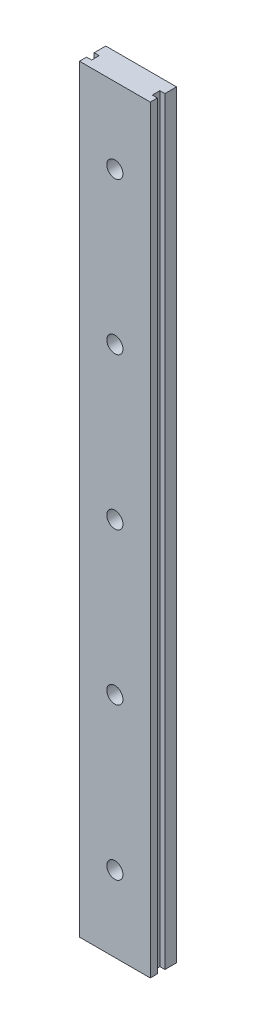
ISO-10303-21;
HEADER;
FILE_DESCRIPTION(('STEP AP214'),'2;1');
FILE_NAME('part.step','',(''),(''),'','','');
FILE_SCHEMA(('AUTOMOTIVE_DESIGN { 1 0 10303 214 1 1 1 1 }'));
ENDSEC;
DATA;
#1=APPLICATION_CONTEXT('core data for automotive mechanical design processes');
#2=APPLICATION_PROTOCOL_DEFINITION('international standard','automotive_design',2000,#1);
#3=PRODUCT_CONTEXT('',#1,'mechanical');
#4=PRODUCT('Part','Part','',(#3));
#5=PRODUCT_RELATED_PRODUCT_CATEGORY('part','',(#4));
#6=PRODUCT_DEFINITION_FORMATION('','',#4);
#7=PRODUCT_DEFINITION_CONTEXT('part definition',#1,'design');
#8=PRODUCT_DEFINITION('design','',#6,#7);
#9=PRODUCT_DEFINITION_SHAPE('','',#8);
#10=(LENGTH_UNIT() NAMED_UNIT(*) SI_UNIT(.MILLI.,.METRE.));
#11=(NAMED_UNIT(*) PLANE_ANGLE_UNIT() SI_UNIT($,.RADIAN.));
#12=(NAMED_UNIT(*) SI_UNIT($,.STERADIAN.) SOLID_ANGLE_UNIT());
#13=UNCERTAINTY_MEASURE_WITH_UNIT(LENGTH_MEASURE(1.E-05),#10,'distance_accuracy_value','');
#14=(GEOMETRIC_REPRESENTATION_CONTEXT(3) GLOBAL_UNCERTAINTY_ASSIGNED_CONTEXT((#13)) GLOBAL_UNIT_ASSIGNED_CONTEXT((#10,
#11,#12)) REPRESENTATION_CONTEXT('',''));
#15=CARTESIAN_POINT('',(0.,0.,0.));
#16=DIRECTION('',(0.,0.,1.));
#17=DIRECTION('',(1.,0.,0.));
#18=AXIS2_PLACEMENT_3D('',#15,#16,#17);
#19=CARTESIAN_POINT('',(0.,150.,0.));
#20=DIRECTION('',(0.,0.,-1.));
#21=DIRECTION('',(-1.,0.,0.));
#22=AXIS2_PLACEMENT_3D('',#19,#20,#21);
#23=PLANE('',#22);
#24=CARTESIAN_POINT('',(7.,15.,0.));
#25=DIRECTION('',(0.,0.,-1.));
#26=DIRECTION('',(-1.,0.,0.));
#27=AXIS2_PLACEMENT_3D('',#24,#25,#26);
#28=CIRCLE('',#27,1.6);
#29=CARTESIAN_POINT('',(5.4,15.,0.));
#30=VERTEX_POINT('',#29);
#31=EDGE_CURVE('E159',#30,#30,#28,.T.);
#32=ORIENTED_EDGE('',*,*,#31,.T.);
#33=EDGE_LOOP('',(#32));
#34=FACE_BOUND('',#33,.T.);
#35=CARTESIAN_POINT('',(7.0000000000001,45.,0.));
#36=DIRECTION('',(0.,0.,-1.));
#37=DIRECTION('',(-1.,0.,0.));
#38=AXIS2_PLACEMENT_3D('',#35,#36,#37);
#39=CIRCLE('',#38,1.6);
#40=CARTESIAN_POINT('',(5.4000000000001,45.,0.));
#41=VERTEX_POINT('',#40);
#42=EDGE_CURVE('E267',#41,#41,#39,.T.);
#43=ORIENTED_EDGE('',*,*,#42,.T.);
#44=EDGE_LOOP('',(#43));
#45=FACE_BOUND('',#44,.T.);
#46=CARTESIAN_POINT('',(7.00000000000021,75.,0.));
#47=DIRECTION('',(0.,0.,-1.));
#48=DIRECTION('',(-1.,0.,0.));
#49=AXIS2_PLACEMENT_3D('',#46,#47,#48);
#50=CIRCLE('',#49,1.6);
#51=CARTESIAN_POINT('',(5.4000000000002,75.,0.));
#52=VERTEX_POINT('',#51);
#53=EDGE_CURVE('E271',#52,#52,#50,.T.);
#54=ORIENTED_EDGE('',*,*,#53,.T.);
#55=EDGE_LOOP('',(#54));
#56=FACE_BOUND('',#55,.T.);
#57=CARTESIAN_POINT('',(7.00000000000031,105.,0.));
#58=DIRECTION('',(0.,0.,-1.));
#59=DIRECTION('',(-1.,0.,0.));
#60=AXIS2_PLACEMENT_3D('',#57,#58,#59);
#61=CIRCLE('',#60,1.6);
#62=CARTESIAN_POINT('',(5.40000000000031,105.,0.));
#63=VERTEX_POINT('',#62);
#64=EDGE_CURVE('E275',#63,#63,#61,.T.);
#65=ORIENTED_EDGE('',*,*,#64,.T.);
#66=EDGE_LOOP('',(#65));
#67=FACE_BOUND('',#66,.T.);
#68=CARTESIAN_POINT('',(7.00000000000041,135.,0.));
#69=DIRECTION('',(0.,0.,-1.));
#70=DIRECTION('',(-1.,0.,0.));
#71=AXIS2_PLACEMENT_3D('',#68,#69,#70);
#72=CIRCLE('',#71,1.6);
#73=CARTESIAN_POINT('',(5.40000000000041,135.,0.));
#74=VERTEX_POINT('',#73);
#75=EDGE_CURVE('E278',#74,#74,#72,.T.);
#76=ORIENTED_EDGE('',*,*,#75,.T.);
#77=EDGE_LOOP('',(#76));
#78=FACE_BOUND('',#77,.T.);
#79=DIRECTION('',(1.,0.,0.));
#80=VECTOR('',#79,1.);
#81=CARTESIAN_POINT('',(0.,0.,0.));
#82=LINE('',#81,#80);
#83=CARTESIAN_POINT('',(0.,0.,0.));
#84=VERTEX_POINT('',#83);
#85=CARTESIAN_POINT('',(14.,0.,0.));
#86=VERTEX_POINT('',#85);
#87=EDGE_CURVE('E155',#84,#86,#82,.T.);
#88=ORIENTED_EDGE('',*,*,#87,.T.);
#89=DIRECTION('',(0.,-1.,0.));
#90=VECTOR('',#89,1.);
#91=CARTESIAN_POINT('',(14.,150.,0.));
#92=LINE('',#91,#90);
#93=CARTESIAN_POINT('',(14.,150.,0.));
#94=VERTEX_POINT('',#93);
#95=EDGE_CURVE('E11',#94,#86,#92,.T.);
#96=ORIENTED_EDGE('',*,*,#95,.F.);
#97=DIRECTION('',(1.,0.,0.));
#98=VECTOR('',#97,1.);
#99=CARTESIAN_POINT('',(0.,150.,0.));
#100=LINE('',#99,#98);
#101=CARTESIAN_POINT('',(0.,150.,0.));
#102=VERTEX_POINT('',#101);
#103=EDGE_CURVE('E178',#102,#94,#100,.T.);
#104=ORIENTED_EDGE('',*,*,#103,.F.);
#105=DIRECTION('',(0.,-1.,0.));
#106=VECTOR('',#105,1.);
#107=CARTESIAN_POINT('',(0.,150.,0.));
#108=LINE('',#107,#106);
#109=EDGE_CURVE('E151',#102,#84,#108,.T.);
#110=ORIENTED_EDGE('',*,*,#109,.T.);
#111=EDGE_LOOP('',(#88,#96,#104,#110));
#112=FACE_BOUND('',#111,.T.);
#113=ADVANCED_FACE('F35',(#34,#45,#56,#67,#78,#112),#23,.F.);
#114=CARTESIAN_POINT('',(14.,150.,0.));
#115=DIRECTION('',(-1.,0.,0.));
#116=DIRECTION('',(0.,0.,1.));
#117=AXIS2_PLACEMENT_3D('',#114,#115,#116);
#118=PLANE('',#117);
#119=DIRECTION('',(0.,0.,-1.));
#120=VECTOR('',#119,1.);
#121=CARTESIAN_POINT('',(14.,0.,0.));
#122=LINE('',#121,#120);
#123=CARTESIAN_POINT('',(14.,0.,-1.4));
#124=VERTEX_POINT('',#123);
#125=EDGE_CURVE('E158',#86,#124,#122,.T.);
#126=ORIENTED_EDGE('',*,*,#125,.T.);
#127=DIRECTION('',(0.,-1.,0.));
#128=VECTOR('',#127,1.);
#129=CARTESIAN_POINT('',(14.,150.,-1.4));
#130=LINE('',#129,#128);
#131=CARTESIAN_POINT('',(14.,150.,-1.4));
#132=VERTEX_POINT('',#131);
#133=EDGE_CURVE('E43',#132,#124,#130,.T.);
#134=ORIENTED_EDGE('',*,*,#133,.F.);
#135=DIRECTION('',(0.,0.,-1.));
#136=VECTOR('',#135,1.);
#137=CARTESIAN_POINT('',(14.,150.,0.));
#138=LINE('',#137,#136);
#139=EDGE_CURVE('E106',#94,#132,#138,.T.);
#140=ORIENTED_EDGE('',*,*,#139,.F.);
#141=ORIENTED_EDGE('',*,*,#95,.T.);
#142=EDGE_LOOP('',(#126,#134,#140,#141));
#143=FACE_BOUND('',#142,.T.);
#144=ADVANCED_FACE('F256',(#143),#118,.F.);
#145=CARTESIAN_POINT('',(14.,150.,-1.4));
#146=DIRECTION('',(0.,0.,1.));
#147=DIRECTION('',(1.,0.,0.));
#148=AXIS2_PLACEMENT_3D('',#145,#146,#147);
#149=PLANE('',#148);
#150=DIRECTION('',(-1.,0.,0.));
#151=VECTOR('',#150,1.);
#152=CARTESIAN_POINT('',(14.,0.,-1.4));
#153=LINE('',#152,#151);
#154=CARTESIAN_POINT('',(13.,0.,-1.4));
#155=VERTEX_POINT('',#154);
#156=EDGE_CURVE('E161',#124,#155,#153,.T.);
#157=ORIENTED_EDGE('',*,*,#156,.T.);
#158=DIRECTION('',(0.,-1.,0.));
#159=VECTOR('',#158,1.);
#160=CARTESIAN_POINT('',(13.,150.,-1.4));
#161=LINE('',#160,#159);
#162=CARTESIAN_POINT('',(13.,150.,-1.4));
#163=VERTEX_POINT('',#162);
#164=EDGE_CURVE('E197',#163,#155,#161,.T.);
#165=ORIENTED_EDGE('',*,*,#164,.F.);
#166=DIRECTION('',(-1.,0.,0.));
#167=VECTOR('',#166,1.);
#168=CARTESIAN_POINT('',(14.,150.,-1.4));
#169=LINE('',#168,#167);
#170=EDGE_CURVE('E205',#132,#163,#169,.T.);
#171=ORIENTED_EDGE('',*,*,#170,.F.);
#172=ORIENTED_EDGE('',*,*,#133,.T.);
#173=EDGE_LOOP('',(#157,#165,#171,#172));
#174=FACE_BOUND('',#173,.T.);
#175=ADVANCED_FACE('F203',(#174),#149,.F.);
#176=CARTESIAN_POINT('',(13.,150.,-1.4));
#177=DIRECTION('',(-1.,0.,0.));
#178=DIRECTION('',(0.,0.,1.));
#179=AXIS2_PLACEMENT_3D('',#176,#177,#178);
#180=PLANE('',#179);
#181=DIRECTION('',(0.,0.,-1.));
#182=VECTOR('',#181,1.);
#183=CARTESIAN_POINT('',(13.,0.,-1.4));
#184=LINE('',#183,#182);
#185=CARTESIAN_POINT('',(13.,0.,-2.9));
#186=VERTEX_POINT('',#185);
#187=EDGE_CURVE('E163',#155,#186,#184,.T.);
#188=ORIENTED_EDGE('',*,*,#187,.T.);
#189=DIRECTION('',(0.,-1.,0.));
#190=VECTOR('',#189,1.);
#191=CARTESIAN_POINT('',(13.,150.,-2.9));
#192=LINE('',#191,#190);
#193=CARTESIAN_POINT('',(13.,150.,-2.9));
#194=VERTEX_POINT('',#193);
#195=EDGE_CURVE('E194',#194,#186,#192,.T.);
#196=ORIENTED_EDGE('',*,*,#195,.F.);
#197=DIRECTION('',(0.,0.,-1.));
#198=VECTOR('',#197,1.);
#199=CARTESIAN_POINT('',(13.,150.,-1.4));
#200=LINE('',#199,#198);
#201=EDGE_CURVE('E223',#163,#194,#200,.T.);
#202=ORIENTED_EDGE('',*,*,#201,.F.);
#203=ORIENTED_EDGE('',*,*,#164,.T.);
#204=EDGE_LOOP('',(#188,#196,#202,#203));
#205=FACE_BOUND('',#204,.T.);
#206=ADVANCED_FACE('F214',(#205),#180,.F.);
#207=CARTESIAN_POINT('',(13.,150.,-2.9));
#208=DIRECTION('',(0.,0.,-1.));
#209=DIRECTION('',(-1.,0.,0.));
#210=AXIS2_PLACEMENT_3D('',#207,#208,#209);
#211=PLANE('',#210);
#212=DIRECTION('',(1.,0.,0.));
#213=VECTOR('',#212,1.);
#214=CARTESIAN_POINT('',(13.,0.,-2.9));
#215=LINE('',#214,#213);
#216=CARTESIAN_POINT('',(14.,0.,-2.9));
#217=VERTEX_POINT('',#216);
#218=EDGE_CURVE('E165',#186,#217,#215,.T.);
#219=ORIENTED_EDGE('',*,*,#218,.T.);
#220=DIRECTION('',(0.,-1.,0.));
#221=VECTOR('',#220,1.);
#222=CARTESIAN_POINT('',(14.,150.,-2.9));
#223=LINE('',#222,#221);
#224=CARTESIAN_POINT('',(14.,150.,-2.9));
#225=VERTEX_POINT('',#224);
#226=EDGE_CURVE('E191',#225,#217,#223,.T.);
#227=ORIENTED_EDGE('',*,*,#226,.F.);
#228=DIRECTION('',(1.,0.,0.));
#229=VECTOR('',#228,1.);
#230=CARTESIAN_POINT('',(13.,150.,-2.9));
#231=LINE('',#230,#229);
#232=EDGE_CURVE('E220',#194,#225,#231,.T.);
#233=ORIENTED_EDGE('',*,*,#232,.F.);
#234=ORIENTED_EDGE('',*,*,#195,.T.);
#235=EDGE_LOOP('',(#219,#227,#233,#234));
#236=FACE_BOUND('',#235,.T.);
#237=ADVANCED_FACE('F218',(#236),#211,.F.);
#238=CARTESIAN_POINT('',(14.,150.,-2.9));
#239=DIRECTION('',(-1.,0.,0.));
#240=DIRECTION('',(0.,0.,1.));
#241=AXIS2_PLACEMENT_3D('',#238,#239,#240);
#242=PLANE('',#241);
#243=DIRECTION('',(0.,0.,-1.));
#244=VECTOR('',#243,1.);
#245=CARTESIAN_POINT('',(14.,0.,-2.9));
#246=LINE('',#245,#244);
#247=CARTESIAN_POINT('',(14.,0.,-5.2));
#248=VERTEX_POINT('',#247);
#249=EDGE_CURVE('E167',#217,#248,#246,.T.);
#250=ORIENTED_EDGE('',*,*,#249,.T.);
#251=DIRECTION('',(0.,-1.,0.));
#252=VECTOR('',#251,1.);
#253=CARTESIAN_POINT('',(14.,150.,-5.2));
#254=LINE('',#253,#252);
#255=CARTESIAN_POINT('',(14.,150.,-5.2));
#256=VERTEX_POINT('',#255);
#257=EDGE_CURVE('E188',#256,#248,#254,.T.);
#258=ORIENTED_EDGE('',*,*,#257,.F.);
#259=DIRECTION('',(0.,0.,-1.));
#260=VECTOR('',#259,1.);
#261=CARTESIAN_POINT('',(14.,150.,-2.9));
#262=LINE('',#261,#260);
#263=EDGE_CURVE('E222',#225,#256,#262,.T.);
#264=ORIENTED_EDGE('',*,*,#263,.F.);
#265=ORIENTED_EDGE('',*,*,#226,.T.);
#266=EDGE_LOOP('',(#250,#258,#264,#265));
#267=FACE_BOUND('',#266,.T.);
#268=ADVANCED_FACE('F309',(#267),#242,.F.);
#269=CARTESIAN_POINT('',(0.,150.,-5.2));
#270=DIRECTION('',(0.,0.,1.));
#271=DIRECTION('',(1.,0.,0.));
#272=AXIS2_PLACEMENT_3D('',#269,#270,#271);
#273=PLANE('',#272);
#274=CARTESIAN_POINT('',(7.,15.,-5.2));
#275=DIRECTION('',(0.,0.,-1.));
#276=DIRECTION('',(-1.,0.,0.));
#277=AXIS2_PLACEMENT_3D('',#274,#275,#276);
#278=CIRCLE('',#277,1.6);
#279=CARTESIAN_POINT('',(5.4,15.,-5.2));
#280=VERTEX_POINT('',#279);
#281=EDGE_CURVE('E299',#280,#280,#278,.T.);
#282=ORIENTED_EDGE('',*,*,#281,.F.);
#283=EDGE_LOOP('',(#282));
#284=FACE_BOUND('',#283,.T.);
#285=CARTESIAN_POINT('',(7.0000000000001,45.,-5.2));
#286=DIRECTION('',(0.,0.,-1.));
#287=DIRECTION('',(-1.,0.,0.));
#288=AXIS2_PLACEMENT_3D('',#285,#286,#287);
#289=CIRCLE('',#288,1.6);
#290=CARTESIAN_POINT('',(5.4000000000001,45.,-5.2));
#291=VERTEX_POINT('',#290);
#292=EDGE_CURVE('E295',#291,#291,#289,.T.);
#293=ORIENTED_EDGE('',*,*,#292,.F.);
#294=EDGE_LOOP('',(#293));
#295=FACE_BOUND('',#294,.T.);
#296=CARTESIAN_POINT('',(7.0000000000002,75.,-5.2));
#297=DIRECTION('',(0.,0.,-1.));
#298=DIRECTION('',(-1.,0.,0.));
#299=AXIS2_PLACEMENT_3D('',#296,#297,#298);
#300=CIRCLE('',#299,1.6);
#301=CARTESIAN_POINT('',(5.4000000000002,75.,-5.2));
#302=VERTEX_POINT('',#301);
#303=EDGE_CURVE('E291',#302,#302,#300,.T.);
#304=ORIENTED_EDGE('',*,*,#303,.F.);
#305=EDGE_LOOP('',(#304));
#306=FACE_BOUND('',#305,.T.);
#307=CARTESIAN_POINT('',(7.00000000000031,105.,-5.2));
#308=DIRECTION('',(0.,0.,-1.));
#309=DIRECTION('',(-1.,0.,0.));
#310=AXIS2_PLACEMENT_3D('',#307,#308,#309);
#311=CIRCLE('',#310,1.6);
#312=CARTESIAN_POINT('',(5.40000000000031,105.,-5.2));
#313=VERTEX_POINT('',#312);
#314=EDGE_CURVE('E280',#313,#313,#311,.T.);
#315=ORIENTED_EDGE('',*,*,#314,.F.);
#316=EDGE_LOOP('',(#315));
#317=FACE_BOUND('',#316,.T.);
#318=CARTESIAN_POINT('',(7.00000000000041,135.,-5.2));
#319=DIRECTION('',(0.,0.,-1.));
#320=DIRECTION('',(-1.,0.,0.));
#321=AXIS2_PLACEMENT_3D('',#318,#319,#320);
#322=CIRCLE('',#321,1.6);
#323=CARTESIAN_POINT('',(5.40000000000041,135.,-5.2));
#324=VERTEX_POINT('',#323);
#325=EDGE_CURVE('E281',#324,#324,#322,.T.);
#326=ORIENTED_EDGE('',*,*,#325,.F.);
#327=EDGE_LOOP('',(#326));
#328=FACE_BOUND('',#327,.T.);
#329=DIRECTION('',(-1.,0.,0.));
#330=VECTOR('',#329,1.);
#331=CARTESIAN_POINT('',(0.,0.,-5.2));
#332=LINE('',#331,#330);
#333=CARTESIAN_POINT('',(0.,0.,-5.2));
#334=VERTEX_POINT('',#333);
#335=EDGE_CURVE('E169',#248,#334,#332,.T.);
#336=ORIENTED_EDGE('',*,*,#335,.T.);
#337=DIRECTION('',(0.,-1.,0.));
#338=VECTOR('',#337,1.);
#339=CARTESIAN_POINT('',(0.,150.,-5.2));
#340=LINE('',#339,#338);
#341=CARTESIAN_POINT('',(0.,150.,-5.2));
#342=VERTEX_POINT('',#341);
#343=EDGE_CURVE('E185',#342,#334,#340,.T.);
#344=ORIENTED_EDGE('',*,*,#343,.F.);
#345=DIRECTION('',(-1.,0.,0.));
#346=VECTOR('',#345,1.);
#347=CARTESIAN_POINT('',(0.,150.,-5.2));
#348=LINE('',#347,#346);
#349=EDGE_CURVE('E225',#256,#342,#348,.T.);
#350=ORIENTED_EDGE('',*,*,#349,.F.);
#351=ORIENTED_EDGE('',*,*,#257,.T.);
#352=EDGE_LOOP('',(#336,#344,#350,#351));
#353=FACE_BOUND('',#352,.T.);
#354=ADVANCED_FACE('F306',(#284,#295,#306,#317,#328,#353),#273,.F.);
#355=CARTESIAN_POINT('',(0.,150.,-2.9));
#356=DIRECTION('',(1.,0.,0.));
#357=DIRECTION('',(0.,0.,-1.));
#358=AXIS2_PLACEMENT_3D('',#355,#356,#357);
#359=PLANE('',#358);
#360=DIRECTION('',(0.,0.,1.));
#361=VECTOR('',#360,1.);
#362=CARTESIAN_POINT('',(0.,0.,-2.9));
#363=LINE('',#362,#361);
#364=CARTESIAN_POINT('',(0.,0.,-2.9));
#365=VERTEX_POINT('',#364);
#366=EDGE_CURVE('E171',#334,#365,#363,.T.);
#367=ORIENTED_EDGE('',*,*,#366,.T.);
#368=DIRECTION('',(0.,-1.,0.));
#369=VECTOR('',#368,1.);
#370=CARTESIAN_POINT('',(0.,150.,-2.9));
#371=LINE('',#370,#369);
#372=CARTESIAN_POINT('',(0.,150.,-2.9));
#373=VERTEX_POINT('',#372);
#374=EDGE_CURVE('E182',#373,#365,#371,.T.);
#375=ORIENTED_EDGE('',*,*,#374,.F.);
#376=DIRECTION('',(0.,0.,1.));
#377=VECTOR('',#376,1.);
#378=CARTESIAN_POINT('',(0.,150.,-2.9));
#379=LINE('',#378,#377);
#380=EDGE_CURVE('E231',#342,#373,#379,.T.);
#381=ORIENTED_EDGE('',*,*,#380,.F.);
#382=ORIENTED_EDGE('',*,*,#343,.T.);
#383=EDGE_LOOP('',(#367,#375,#381,#382));
#384=FACE_BOUND('',#383,.T.);
#385=ADVANCED_FACE('F237',(#384),#359,.F.);
#386=CARTESIAN_POINT('',(1.,150.,-2.9));
#387=DIRECTION('',(0.,0.,-1.));
#388=DIRECTION('',(-1.,0.,0.));
#389=AXIS2_PLACEMENT_3D('',#386,#387,#388);
#390=PLANE('',#389);
#391=DIRECTION('',(1.,0.,0.));
#392=VECTOR('',#391,1.);
#393=CARTESIAN_POINT('',(1.,0.,-2.9));
#394=LINE('',#393,#392);
#395=CARTESIAN_POINT('',(1.,0.,-2.9));
#396=VERTEX_POINT('',#395);
#397=EDGE_CURVE('E173',#365,#396,#394,.T.);
#398=ORIENTED_EDGE('',*,*,#397,.T.);
#399=DIRECTION('',(0.,-1.,0.));
#400=VECTOR('',#399,1.);
#401=CARTESIAN_POINT('',(1.,150.,-2.9));
#402=LINE('',#401,#400);
#403=CARTESIAN_POINT('',(1.,150.,-2.9));
#404=VERTEX_POINT('',#403);
#405=EDGE_CURVE('E146',#404,#396,#402,.T.);
#406=ORIENTED_EDGE('',*,*,#405,.F.);
#407=DIRECTION('',(1.,0.,0.));
#408=VECTOR('',#407,1.);
#409=CARTESIAN_POINT('',(1.,150.,-2.9));
#410=LINE('',#409,#408);
#411=EDGE_CURVE('E137',#373,#404,#410,.T.);
#412=ORIENTED_EDGE('',*,*,#411,.F.);
#413=ORIENTED_EDGE('',*,*,#374,.T.);
#414=EDGE_LOOP('',(#398,#406,#412,#413));
#415=FACE_BOUND('',#414,.T.);
#416=ADVANCED_FACE('F241',(#415),#390,.F.);
#417=CARTESIAN_POINT('',(1.,150.,-1.4));
#418=DIRECTION('',(1.,0.,0.));
#419=DIRECTION('',(0.,0.,-1.));
#420=AXIS2_PLACEMENT_3D('',#417,#418,#419);
#421=PLANE('',#420);
#422=DIRECTION('',(0.,0.,1.));
#423=VECTOR('',#422,1.);
#424=CARTESIAN_POINT('',(1.,0.,-1.4));
#425=LINE('',#424,#423);
#426=CARTESIAN_POINT('',(1.,0.,-1.4));
#427=VERTEX_POINT('',#426);
#428=EDGE_CURVE('E145',#396,#427,#425,.T.);
#429=ORIENTED_EDGE('',*,*,#428,.T.);
#430=DIRECTION('',(0.,-1.,0.));
#431=VECTOR('',#430,1.);
#432=CARTESIAN_POINT('',(1.,150.,-1.4));
#433=LINE('',#432,#431);
#434=CARTESIAN_POINT('',(1.,150.,-1.4));
#435=VERTEX_POINT('',#434);
#436=EDGE_CURVE('E142',#435,#427,#433,.T.);
#437=ORIENTED_EDGE('',*,*,#436,.F.);
#438=DIRECTION('',(0.,0.,1.));
#439=VECTOR('',#438,1.);
#440=CARTESIAN_POINT('',(1.,150.,-1.4));
#441=LINE('',#440,#439);
#442=EDGE_CURVE('E131',#404,#435,#441,.T.);
#443=ORIENTED_EDGE('',*,*,#442,.F.);
#444=ORIENTED_EDGE('',*,*,#405,.T.);
#445=EDGE_LOOP('',(#429,#437,#443,#444));
#446=FACE_BOUND('',#445,.T.);
#447=ADVANCED_FACE('F143',(#446),#421,.F.);
#448=CARTESIAN_POINT('',(0.,150.,-1.4));
#449=DIRECTION('',(0.,0.,1.));
#450=DIRECTION('',(1.,0.,0.));
#451=AXIS2_PLACEMENT_3D('',#448,#449,#450);
#452=PLANE('',#451);
#453=DIRECTION('',(-1.,0.,0.));
#454=VECTOR('',#453,1.);
#455=CARTESIAN_POINT('',(0.,0.,-1.4));
#456=LINE('',#455,#454);
#457=CARTESIAN_POINT('',(0.,0.,-1.4));
#458=VERTEX_POINT('',#457);
#459=EDGE_CURVE('E92',#427,#458,#456,.T.);
#460=ORIENTED_EDGE('',*,*,#459,.T.);
#461=DIRECTION('',(0.,-1.,0.));
#462=VECTOR('',#461,1.);
#463=CARTESIAN_POINT('',(0.,150.,-1.4));
#464=LINE('',#463,#462);
#465=CARTESIAN_POINT('',(0.,150.,-1.4));
#466=VERTEX_POINT('',#465);
#467=EDGE_CURVE('E147',#466,#458,#464,.T.);
#468=ORIENTED_EDGE('',*,*,#467,.F.);
#469=DIRECTION('',(-1.,0.,0.));
#470=VECTOR('',#469,1.);
#471=CARTESIAN_POINT('',(0.,150.,-1.4));
#472=LINE('',#471,#470);
#473=EDGE_CURVE('E135',#435,#466,#472,.T.);
#474=ORIENTED_EDGE('',*,*,#473,.F.);
#475=ORIENTED_EDGE('',*,*,#436,.T.);
#476=EDGE_LOOP('',(#460,#468,#474,#475));
#477=FACE_BOUND('',#476,.T.);
#478=ADVANCED_FACE('F149',(#477),#452,.F.);
#479=CARTESIAN_POINT('',(0.,150.,0.));
#480=DIRECTION('',(1.,0.,0.));
#481=DIRECTION('',(0.,0.,-1.));
#482=AXIS2_PLACEMENT_3D('',#479,#480,#481);
#483=PLANE('',#482);
#484=DIRECTION('',(0.,0.,1.));
#485=VECTOR('',#484,1.);
#486=CARTESIAN_POINT('',(0.,0.,0.));
#487=LINE('',#486,#485);
#488=EDGE_CURVE('E98',#458,#84,#487,.T.);
#489=ORIENTED_EDGE('',*,*,#488,.T.);
#490=ORIENTED_EDGE('',*,*,#109,.F.);
#491=DIRECTION('',(0.,0.,1.));
#492=VECTOR('',#491,1.);
#493=CARTESIAN_POINT('',(0.,150.,0.));
#494=LINE('',#493,#492);
#495=EDGE_CURVE('E51',#466,#102,#494,.T.);
#496=ORIENTED_EDGE('',*,*,#495,.F.);
#497=ORIENTED_EDGE('',*,*,#467,.T.);
#498=EDGE_LOOP('',(#489,#490,#496,#497));
#499=FACE_BOUND('',#498,.T.);
#500=ADVANCED_FACE('F245',(#499),#483,.F.);
#501=CARTESIAN_POINT('',(0.,150.,0.));
#502=DIRECTION('',(0.,1.,0.));
#503=DIRECTION('',(0.,0.,1.));
#504=AXIS2_PLACEMENT_3D('',#501,#502,#503);
#505=PLANE('',#504);
#506=ORIENTED_EDGE('',*,*,#103,.T.);
#507=ORIENTED_EDGE('',*,*,#139,.T.);
#508=ORIENTED_EDGE('',*,*,#170,.T.);
#509=ORIENTED_EDGE('',*,*,#201,.T.);
#510=ORIENTED_EDGE('',*,*,#232,.T.);
#511=ORIENTED_EDGE('',*,*,#263,.T.);
#512=ORIENTED_EDGE('',*,*,#349,.T.);
#513=ORIENTED_EDGE('',*,*,#380,.T.);
#514=ORIENTED_EDGE('',*,*,#411,.T.);
#515=ORIENTED_EDGE('',*,*,#442,.T.);
#516=ORIENTED_EDGE('',*,*,#473,.T.);
#517=ORIENTED_EDGE('',*,*,#495,.T.);
#518=EDGE_LOOP('',(#506,#507,#508,#509,#510,#511,#512,#513,#514,#515,#516,#517));
#519=FACE_BOUND('',#518,.T.);
#520=ADVANCED_FACE('F133',(#519),#505,.T.);
#521=CARTESIAN_POINT('',(0.,0.,0.));
#522=DIRECTION('',(0.,1.,0.));
#523=DIRECTION('',(0.,0.,1.));
#524=AXIS2_PLACEMENT_3D('',#521,#522,#523);
#525=PLANE('',#524);
#526=ORIENTED_EDGE('',*,*,#87,.F.);
#527=ORIENTED_EDGE('',*,*,#488,.F.);
#528=ORIENTED_EDGE('',*,*,#459,.F.);
#529=ORIENTED_EDGE('',*,*,#428,.F.);
#530=ORIENTED_EDGE('',*,*,#397,.F.);
#531=ORIENTED_EDGE('',*,*,#366,.F.);
#532=ORIENTED_EDGE('',*,*,#335,.F.);
#533=ORIENTED_EDGE('',*,*,#249,.F.);
#534=ORIENTED_EDGE('',*,*,#218,.F.);
#535=ORIENTED_EDGE('',*,*,#187,.F.);
#536=ORIENTED_EDGE('',*,*,#156,.F.);
#537=ORIENTED_EDGE('',*,*,#125,.F.);
#538=EDGE_LOOP('',(#526,#527,#528,#529,#530,#531,#532,#533,#534,#535,#536,#537));
#539=FACE_BOUND('',#538,.T.);
#540=ADVANCED_FACE('F209',(#539),#525,.F.);
#541=CARTESIAN_POINT('',(7.00000000000041,135.,0.));
#542=DIRECTION('',(0.,0.,-1.));
#543=DIRECTION('',(-1.,0.,0.));
#544=AXIS2_PLACEMENT_3D('',#541,#542,#543);
#545=CYLINDRICAL_SURFACE('',#544,1.6);
#546=ORIENTED_EDGE('',*,*,#75,.F.);
#547=EDGE_LOOP('',(#546));
#548=FACE_BOUND('',#547,.T.);
#549=ORIENTED_EDGE('',*,*,#325,.T.);
#550=EDGE_LOOP('',(#549));
#551=FACE_BOUND('',#550,.T.);
#552=ADVANCED_FACE('F397',(#548,#551),#545,.F.);
#553=CARTESIAN_POINT('',(7.00000000000031,105.,0.));
#554=DIRECTION('',(0.,0.,-1.));
#555=DIRECTION('',(-1.,0.,0.));
#556=AXIS2_PLACEMENT_3D('',#553,#554,#555);
#557=CYLINDRICAL_SURFACE('',#556,1.6);
#558=ORIENTED_EDGE('',*,*,#64,.F.);
#559=EDGE_LOOP('',(#558));
#560=FACE_BOUND('',#559,.T.);
#561=ORIENTED_EDGE('',*,*,#314,.T.);
#562=EDGE_LOOP('',(#561));
#563=FACE_BOUND('',#562,.T.);
#564=ADVANCED_FACE('F416',(#560,#563),#557,.F.);
#565=CARTESIAN_POINT('',(7.00000000000021,75.,0.));
#566=DIRECTION('',(0.,0.,-1.));
#567=DIRECTION('',(-1.,0.,0.));
#568=AXIS2_PLACEMENT_3D('',#565,#566,#567);
#569=CYLINDRICAL_SURFACE('',#568,1.6);
#570=ORIENTED_EDGE('',*,*,#53,.F.);
#571=EDGE_LOOP('',(#570));
#572=FACE_BOUND('',#571,.T.);
#573=ORIENTED_EDGE('',*,*,#303,.T.);
#574=EDGE_LOOP('',(#573));
#575=FACE_BOUND('',#574,.T.);
#576=ADVANCED_FACE('F425',(#572,#575),#569,.F.);
#577=CARTESIAN_POINT('',(7.0000000000001,45.,0.));
#578=DIRECTION('',(0.,0.,-1.));
#579=DIRECTION('',(-1.,0.,0.));
#580=AXIS2_PLACEMENT_3D('',#577,#578,#579);
#581=CYLINDRICAL_SURFACE('',#580,1.6);
#582=ORIENTED_EDGE('',*,*,#42,.F.);
#583=EDGE_LOOP('',(#582));
#584=FACE_BOUND('',#583,.T.);
#585=ORIENTED_EDGE('',*,*,#292,.T.);
#586=EDGE_LOOP('',(#585));
#587=FACE_BOUND('',#586,.T.);
#588=ADVANCED_FACE('F435',(#584,#587),#581,.F.);
#589=CARTESIAN_POINT('',(7.,15.,0.));
#590=DIRECTION('',(0.,0.,-1.));
#591=DIRECTION('',(-1.,0.,0.));
#592=AXIS2_PLACEMENT_3D('',#589,#590,#591);
#593=CYLINDRICAL_SURFACE('',#592,1.6);
#594=ORIENTED_EDGE('',*,*,#31,.F.);
#595=EDGE_LOOP('',(#594));
#596=FACE_BOUND('',#595,.T.);
#597=ORIENTED_EDGE('',*,*,#281,.T.);
#598=EDGE_LOOP('',(#597));
#599=FACE_BOUND('',#598,.T.);
#600=ADVANCED_FACE('F304',(#596,#599),#593,.F.);
#601=CLOSED_SHELL('',(#113,#144,#175,#206,#237,#268,#354,#385,#416,#447,#478,#500,#520,#540,
#552,#564,#576,#588,#600));
#602=MANIFOLD_SOLID_BREP('B2',#601);
#603=ADVANCED_BREP_SHAPE_REPRESENTATION('',(#18,#602),#14);
#604=SHAPE_DEFINITION_REPRESENTATION(#9,#603);
ENDSEC;
END-ISO-10303-21;
